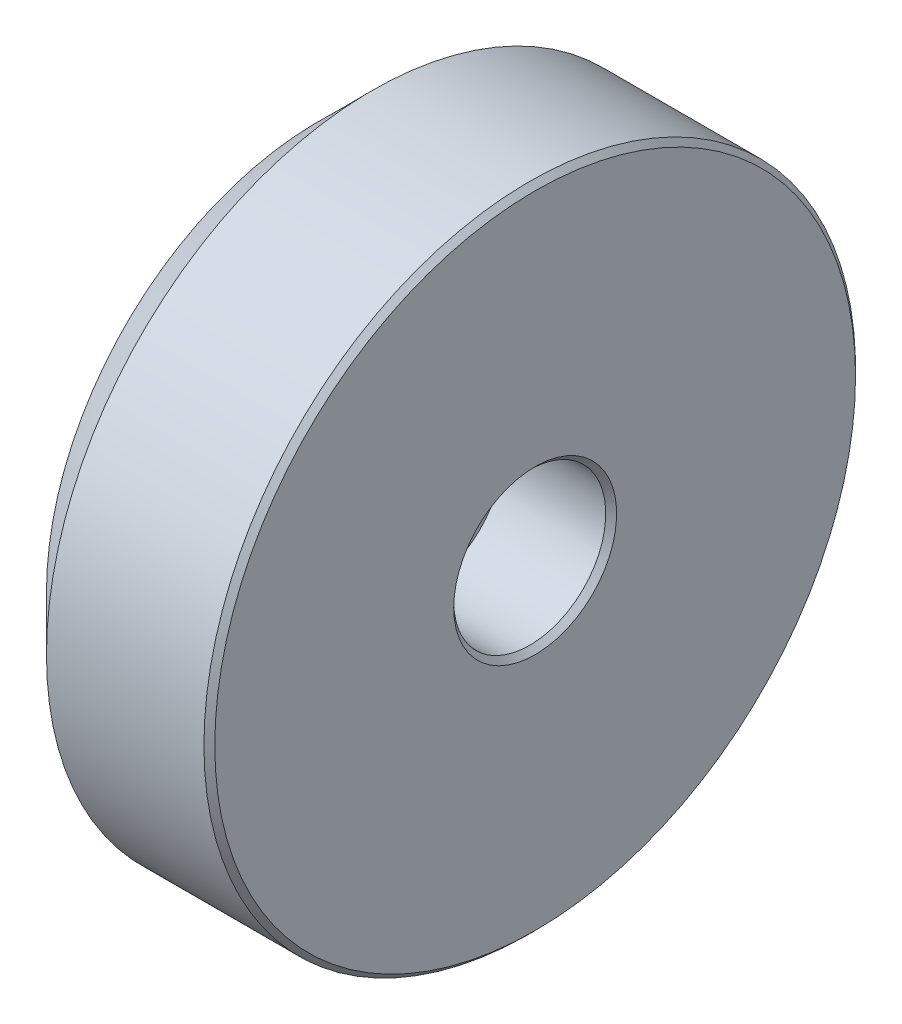
ISO-10303-21;
HEADER;
FILE_DESCRIPTION(('STEP AP214'),'2;1');
FILE_NAME('part.step','',(''),(''),'','','');
FILE_SCHEMA(('AUTOMOTIVE_DESIGN { 1 0 10303 214 1 1 1 1 }'));
ENDSEC;
DATA;
#1=APPLICATION_CONTEXT('core data for automotive mechanical design processes');
#2=APPLICATION_PROTOCOL_DEFINITION('international standard','automotive_design',2000,#1);
#3=PRODUCT_CONTEXT('',#1,'mechanical');
#4=PRODUCT('Part','Part','',(#3));
#5=PRODUCT_RELATED_PRODUCT_CATEGORY('part','',(#4));
#6=PRODUCT_DEFINITION_FORMATION('','',#4);
#7=PRODUCT_DEFINITION_CONTEXT('part definition',#1,'design');
#8=PRODUCT_DEFINITION('design','',#6,#7);
#9=PRODUCT_DEFINITION_SHAPE('','',#8);
#10=(LENGTH_UNIT() NAMED_UNIT(*) SI_UNIT(.MILLI.,.METRE.));
#11=(NAMED_UNIT(*) PLANE_ANGLE_UNIT() SI_UNIT($,.RADIAN.));
#12=(NAMED_UNIT(*) SI_UNIT($,.STERADIAN.) SOLID_ANGLE_UNIT());
#13=UNCERTAINTY_MEASURE_WITH_UNIT(LENGTH_MEASURE(1.E-05),#10,'distance_accuracy_value','');
#14=(GEOMETRIC_REPRESENTATION_CONTEXT(3) GLOBAL_UNCERTAINTY_ASSIGNED_CONTEXT((#13)) GLOBAL_UNIT_ASSIGNED_CONTEXT((#10,
#11,#12)) REPRESENTATION_CONTEXT('',''));
#15=CARTESIAN_POINT('',(0.,0.,0.));
#16=DIRECTION('',(0.,0.,1.));
#17=DIRECTION('',(1.,0.,0.));
#18=AXIS2_PLACEMENT_3D('',#15,#16,#17);
#19=CARTESIAN_POINT('',(0.,0.,0.));
#20=DIRECTION('',(1.,0.,0.));
#21=DIRECTION('',(0.,0.,-1.));
#22=AXIS2_PLACEMENT_3D('',#19,#20,#21);
#23=PLANE('',#22);
#24=CARTESIAN_POINT('',(0.,0.,0.));
#25=DIRECTION('',(1.,0.,0.));
#26=DIRECTION('',(0.,0.,-1.));
#27=AXIS2_PLACEMENT_3D('',#24,#25,#26);
#28=CIRCLE('',#27,10.75);
#29=CARTESIAN_POINT('',(0.,0.,-10.75));
#30=VERTEX_POINT('',#29);
#31=EDGE_CURVE('E70',#30,#30,#28,.T.);
#32=ORIENTED_EDGE('',*,*,#31,.T.);
#33=EDGE_LOOP('',(#32));
#34=FACE_BOUND('',#33,.T.);
#35=CARTESIAN_POINT('',(0.,0.,0.));
#36=DIRECTION('',(-1.,0.,0.));
#37=DIRECTION('',(0.,0.,1.));
#38=AXIS2_PLACEMENT_3D('',#35,#36,#37);
#39=CIRCLE('',#38,25.);
#40=CARTESIAN_POINT('',(0.,0.,25.));
#41=VERTEX_POINT('',#40);
#42=EDGE_CURVE('E78',#41,#41,#39,.T.);
#43=ORIENTED_EDGE('',*,*,#42,.T.);
#44=EDGE_LOOP('',(#43));
#45=FACE_BOUND('',#44,.T.);
#46=ADVANCED_FACE('F45',(#34,#45),#23,.F.);
#47=CARTESIAN_POINT('',(5.,0.,0.));
#48=DIRECTION('',(1.,0.,0.));
#49=DIRECTION('',(0.,0.,-1.));
#50=AXIS2_PLACEMENT_3D('',#47,#48,#49);
#51=CONICAL_SURFACE('',#50,30.,0.785398163397448);
#52=ORIENTED_EDGE('',*,*,#42,.F.);
#53=EDGE_LOOP('',(#52));
#54=FACE_BOUND('',#53,.T.);
#55=CARTESIAN_POINT('',(5.,0.,0.));
#56=DIRECTION('',(-1.,0.,0.));
#57=DIRECTION('',(0.,0.,1.));
#58=AXIS2_PLACEMENT_3D('',#55,#56,#57);
#59=CIRCLE('',#58,30.);
#60=CARTESIAN_POINT('',(5.,0.,30.));
#61=VERTEX_POINT('',#60);
#62=EDGE_CURVE('E82',#61,#61,#59,.T.);
#63=ORIENTED_EDGE('',*,*,#62,.T.);
#64=EDGE_LOOP('',(#63));
#65=FACE_BOUND('',#64,.T.);
#66=ADVANCED_FACE('F121',(#54,#65),#51,.T.);
#67=CARTESIAN_POINT('',(0.,0.,0.));
#68=DIRECTION('',(-1.,0.,0.));
#69=DIRECTION('',(0.,0.,1.));
#70=AXIS2_PLACEMENT_3D('',#67,#68,#69);
#71=CYLINDRICAL_SURFACE('',#70,30.);
#72=CARTESIAN_POINT('',(19.5,0.,0.));
#73=DIRECTION('',(-1.,0.,0.));
#74=DIRECTION('',(0.,0.,1.));
#75=AXIS2_PLACEMENT_3D('',#72,#73,#74);
#76=CIRCLE('',#75,30.);
#77=CARTESIAN_POINT('',(19.5,0.,30.));
#78=VERTEX_POINT('',#77);
#79=EDGE_CURVE('E54',#78,#78,#76,.T.);
#80=ORIENTED_EDGE('',*,*,#79,.T.);
#81=EDGE_LOOP('',(#80));
#82=FACE_BOUND('',#81,.T.);
#83=ORIENTED_EDGE('',*,*,#62,.F.);
#84=EDGE_LOOP('',(#83));
#85=FACE_BOUND('',#84,.T.);
#86=ADVANCED_FACE('F128',(#82,#85),#71,.T.);
#87=CARTESIAN_POINT('',(20.,30.,0.));
#88=DIRECTION('',(-1.,0.,0.));
#89=DIRECTION('',(0.,0.,1.));
#90=AXIS2_PLACEMENT_3D('',#87,#88,#89);
#91=PLANE('',#90);
#92=CARTESIAN_POINT('',(20.,0.,0.));
#93=DIRECTION('',(-1.,0.,0.));
#94=DIRECTION('',(0.,0.,1.));
#95=AXIS2_PLACEMENT_3D('',#92,#93,#94);
#96=CIRCLE('',#95,29.5);
#97=CARTESIAN_POINT('',(20.,0.,29.5));
#98=VERTEX_POINT('',#97);
#99=EDGE_CURVE('E10',#98,#98,#96,.F.);
#100=ORIENTED_EDGE('',*,*,#99,.T.);
#101=EDGE_LOOP('',(#100));
#102=FACE_BOUND('',#101,.T.);
#103=CARTESIAN_POINT('',(20.,0.,0.));
#104=DIRECTION('',(-1.,0.,0.));
#105=DIRECTION('',(0.,0.,1.));
#106=AXIS2_PLACEMENT_3D('',#103,#104,#105);
#107=CIRCLE('',#106,7.5);
#108=CARTESIAN_POINT('',(20.,0.,7.5));
#109=VERTEX_POINT('',#108);
#110=EDGE_CURVE('E64',#109,#109,#107,.T.);
#111=ORIENTED_EDGE('',*,*,#110,.T.);
#112=EDGE_LOOP('',(#111));
#113=FACE_BOUND('',#112,.T.);
#114=ADVANCED_FACE('F154',(#102,#113),#91,.F.);
#115=CARTESIAN_POINT('',(0.,0.,0.));
#116=DIRECTION('',(-1.,0.,0.));
#117=DIRECTION('',(0.,0.,1.));
#118=AXIS2_PLACEMENT_3D('',#115,#116,#117);
#119=CYLINDRICAL_SURFACE('',#118,10.25);
#120=CARTESIAN_POINT('',(0.499999999999997,0.,0.));
#121=DIRECTION('',(1.,0.,0.));
#122=DIRECTION('',(0.,0.,-1.));
#123=AXIS2_PLACEMENT_3D('',#120,#121,#122);
#124=CIRCLE('',#123,10.25);
#125=CARTESIAN_POINT('',(0.499999999999997,0.,-10.25));
#126=VERTEX_POINT('',#125);
#127=EDGE_CURVE('E74',#126,#126,#124,.F.);
#128=ORIENTED_EDGE('',*,*,#127,.T.);
#129=EDGE_LOOP('',(#128));
#130=FACE_BOUND('',#129,.T.);
#131=CARTESIAN_POINT('',(3.,0.,0.));
#132=DIRECTION('',(-1.,0.,0.));
#133=DIRECTION('',(0.,0.,1.));
#134=AXIS2_PLACEMENT_3D('',#131,#132,#133);
#135=CIRCLE('',#134,10.25);
#136=CARTESIAN_POINT('',(3.,0.,10.25));
#137=VERTEX_POINT('',#136);
#138=EDGE_CURVE('E86',#137,#137,#135,.T.);
#139=ORIENTED_EDGE('',*,*,#138,.F.);
#140=EDGE_LOOP('',(#139));
#141=FACE_BOUND('',#140,.T.);
#142=ADVANCED_FACE('F156',(#130,#141),#119,.F.);
#143=CARTESIAN_POINT('',(3.,4.5,0.));
#144=DIRECTION('',(-1.,0.,0.));
#145=DIRECTION('',(0.,0.,1.));
#146=AXIS2_PLACEMENT_3D('',#143,#144,#145);
#147=PLANE('',#146);
#148=ORIENTED_EDGE('',*,*,#138,.T.);
#149=EDGE_LOOP('',(#148));
#150=FACE_BOUND('',#149,.T.);
#151=CARTESIAN_POINT('',(3.,0.,0.));
#152=DIRECTION('',(-1.,0.,0.));
#153=DIRECTION('',(0.,0.,1.));
#154=AXIS2_PLACEMENT_3D('',#151,#152,#153);
#155=CIRCLE('',#154,4.5);
#156=CARTESIAN_POINT('',(3.,0.,4.5));
#157=VERTEX_POINT('',#156);
#158=EDGE_CURVE('E90',#157,#157,#155,.T.);
#159=ORIENTED_EDGE('',*,*,#158,.F.);
#160=EDGE_LOOP('',(#159));
#161=FACE_BOUND('',#160,.T.);
#162=ADVANCED_FACE('F118',(#150,#161),#147,.T.);
#163=CARTESIAN_POINT('',(0.,0.,0.));
#164=DIRECTION('',(-1.,0.,0.));
#165=DIRECTION('',(0.,0.,1.));
#166=AXIS2_PLACEMENT_3D('',#163,#164,#165);
#167=CYLINDRICAL_SURFACE('',#166,4.5);
#168=ORIENTED_EDGE('',*,*,#158,.T.);
#169=EDGE_LOOP('',(#168));
#170=FACE_BOUND('',#169,.T.);
#171=CARTESIAN_POINT('',(10.,0.,0.));
#172=DIRECTION('',(-1.,0.,0.));
#173=DIRECTION('',(0.,0.,1.));
#174=AXIS2_PLACEMENT_3D('',#171,#172,#173);
#175=CIRCLE('',#174,4.5);
#176=CARTESIAN_POINT('',(10.,0.,4.5));
#177=VERTEX_POINT('',#176);
#178=EDGE_CURVE('E94',#177,#177,#175,.T.);
#179=ORIENTED_EDGE('',*,*,#178,.F.);
#180=EDGE_LOOP('',(#179));
#181=FACE_BOUND('',#180,.T.);
#182=ADVANCED_FACE('F107',(#170,#181),#167,.F.);
#183=CARTESIAN_POINT('',(10.,7.,0.));
#184=DIRECTION('',(1.,0.,0.));
#185=DIRECTION('',(0.,0.,-1.));
#186=AXIS2_PLACEMENT_3D('',#183,#184,#185);
#187=PLANE('',#186);
#188=ORIENTED_EDGE('',*,*,#178,.T.);
#189=EDGE_LOOP('',(#188));
#190=FACE_BOUND('',#189,.T.);
#191=CARTESIAN_POINT('',(10.,0.,0.));
#192=DIRECTION('',(-1.,0.,0.));
#193=DIRECTION('',(0.,0.,1.));
#194=AXIS2_PLACEMENT_3D('',#191,#192,#193);
#195=CIRCLE('',#194,7.);
#196=CARTESIAN_POINT('',(10.,0.,7.));
#197=VERTEX_POINT('',#196);
#198=EDGE_CURVE('E98',#197,#197,#195,.T.);
#199=ORIENTED_EDGE('',*,*,#198,.F.);
#200=EDGE_LOOP('',(#199));
#201=FACE_BOUND('',#200,.T.);
#202=ADVANCED_FACE('F105',(#190,#201),#187,.T.);
#203=CARTESIAN_POINT('',(0.,0.,0.));
#204=DIRECTION('',(-1.,0.,0.));
#205=DIRECTION('',(0.,0.,1.));
#206=AXIS2_PLACEMENT_3D('',#203,#204,#205);
#207=CYLINDRICAL_SURFACE('',#206,7.);
#208=CARTESIAN_POINT('',(19.5,0.,0.));
#209=DIRECTION('',(-1.,0.,0.));
#210=DIRECTION('',(0.,0.,1.));
#211=AXIS2_PLACEMENT_3D('',#208,#209,#210);
#212=CIRCLE('',#211,7.);
#213=CARTESIAN_POINT('',(19.5,0.,7.));
#214=VERTEX_POINT('',#213);
#215=EDGE_CURVE('E59',#214,#214,#212,.F.);
#216=ORIENTED_EDGE('',*,*,#215,.T.);
#217=EDGE_LOOP('',(#216));
#218=FACE_BOUND('',#217,.T.);
#219=ORIENTED_EDGE('',*,*,#198,.T.);
#220=EDGE_LOOP('',(#219));
#221=FACE_BOUND('',#220,.T.);
#222=ADVANCED_FACE('F103',(#218,#221),#207,.F.);
#223=CARTESIAN_POINT('',(0.499999999999997,0.,0.));
#224=DIRECTION('',(-1.,0.,0.));
#225=DIRECTION('',(0.,0.,1.));
#226=AXIS2_PLACEMENT_3D('',#223,#224,#225);
#227=CONICAL_SURFACE('',#226,10.25,0.785398163397455);
#228=ORIENTED_EDGE('',*,*,#31,.F.);
#229=EDGE_LOOP('',(#228));
#230=FACE_BOUND('',#229,.T.);
#231=ORIENTED_EDGE('',*,*,#127,.F.);
#232=EDGE_LOOP('',(#231));
#233=FACE_BOUND('',#232,.T.);
#234=ADVANCED_FACE('F115',(#230,#233),#227,.F.);
#235=CARTESIAN_POINT('',(20.,0.,0.));
#236=DIRECTION('',(1.,0.,0.));
#237=DIRECTION('',(0.,0.,-1.));
#238=AXIS2_PLACEMENT_3D('',#235,#236,#237);
#239=CONICAL_SURFACE('',#238,7.5,0.785398163397445);
#240=ORIENTED_EDGE('',*,*,#215,.F.);
#241=EDGE_LOOP('',(#240));
#242=FACE_BOUND('',#241,.T.);
#243=ORIENTED_EDGE('',*,*,#110,.F.);
#244=EDGE_LOOP('',(#243));
#245=FACE_BOUND('',#244,.T.);
#246=ADVANCED_FACE('F139',(#242,#245),#239,.F.);
#247=CARTESIAN_POINT('',(19.5,0.,0.));
#248=DIRECTION('',(-1.,0.,0.));
#249=DIRECTION('',(0.,0.,1.));
#250=AXIS2_PLACEMENT_3D('',#247,#248,#249);
#251=CONICAL_SURFACE('',#250,30.,0.785398163397455);
#252=ORIENTED_EDGE('',*,*,#99,.F.);
#253=EDGE_LOOP('',(#252));
#254=FACE_BOUND('',#253,.T.);
#255=ORIENTED_EDGE('',*,*,#79,.F.);
#256=EDGE_LOOP('',(#255));
#257=FACE_BOUND('',#256,.T.);
#258=ADVANCED_FACE('F48',(#254,#257),#251,.T.);
#259=CLOSED_SHELL('',(#46,#66,#86,#114,#142,#162,#182,#202,#222,#234,#246,#258));
#260=MANIFOLD_SOLID_BREP('B2',#259);
#261=ADVANCED_BREP_SHAPE_REPRESENTATION('',(#18,#260),#14);
#262=SHAPE_DEFINITION_REPRESENTATION(#9,#261);
ENDSEC;
END-ISO-10303-21;
